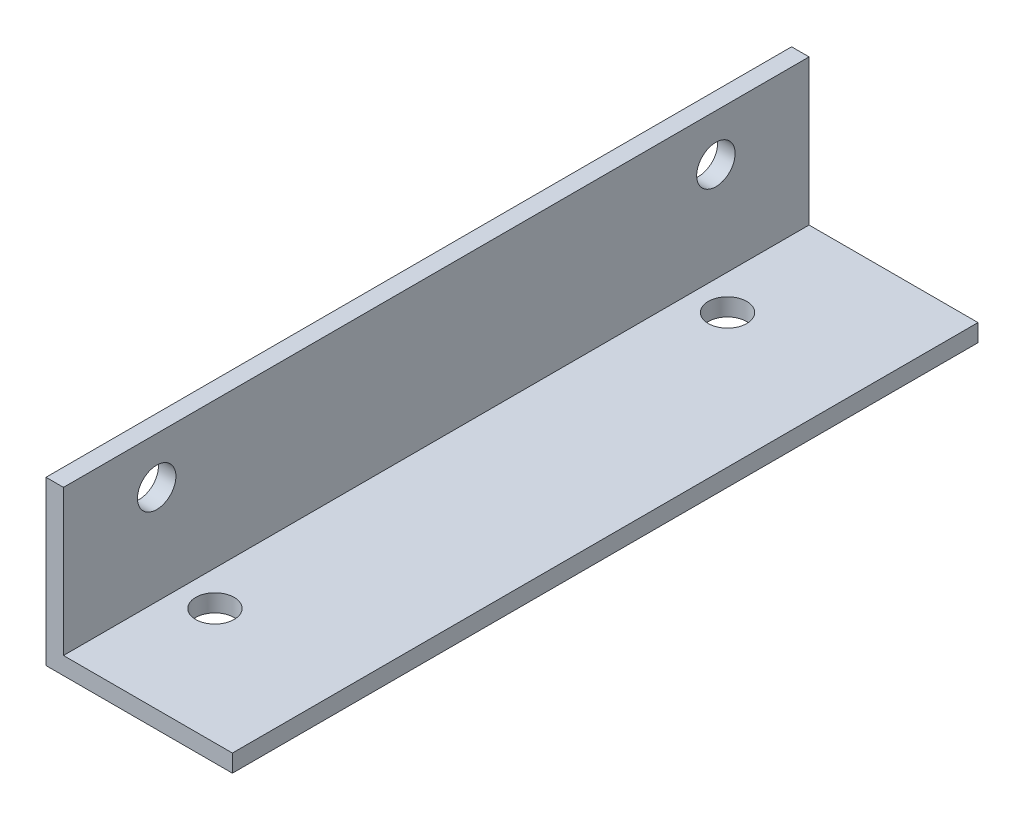
ISO-10303-21;
HEADER;
FILE_DESCRIPTION(('STEP AP214'),'2;1');
FILE_NAME('part.step','',(''),(''),'','','');
FILE_SCHEMA(('AUTOMOTIVE_DESIGN { 1 0 10303 214 1 1 1 1 }'));
ENDSEC;
DATA;
#1=APPLICATION_CONTEXT('core data for automotive mechanical design processes');
#2=APPLICATION_PROTOCOL_DEFINITION('international standard','automotive_design',2000,#1);
#3=PRODUCT_CONTEXT('',#1,'mechanical');
#4=PRODUCT('Part','Part','',(#3));
#5=PRODUCT_RELATED_PRODUCT_CATEGORY('part','',(#4));
#6=PRODUCT_DEFINITION_FORMATION('','',#4);
#7=PRODUCT_DEFINITION_CONTEXT('part definition',#1,'design');
#8=PRODUCT_DEFINITION('design','',#6,#7);
#9=PRODUCT_DEFINITION_SHAPE('','',#8);
#10=(LENGTH_UNIT() NAMED_UNIT(*) SI_UNIT(.MILLI.,.METRE.));
#11=(NAMED_UNIT(*) PLANE_ANGLE_UNIT() SI_UNIT($,.RADIAN.));
#12=(NAMED_UNIT(*) SI_UNIT($,.STERADIAN.) SOLID_ANGLE_UNIT());
#13=UNCERTAINTY_MEASURE_WITH_UNIT(LENGTH_MEASURE(1.E-05),#10,'distance_accuracy_value','');
#14=(GEOMETRIC_REPRESENTATION_CONTEXT(3) GLOBAL_UNCERTAINTY_ASSIGNED_CONTEXT((#13)) GLOBAL_UNIT_ASSIGNED_CONTEXT((#10,
#11,#12)) REPRESENTATION_CONTEXT('',''));
#15=CARTESIAN_POINT('',(0.,0.,0.));
#16=DIRECTION('',(0.,0.,1.));
#17=DIRECTION('',(1.,0.,0.));
#18=AXIS2_PLACEMENT_3D('',#15,#16,#17);
#19=CARTESIAN_POINT('',(0.,14.,32.));
#20=DIRECTION('',(1.,0.,0.));
#21=DIRECTION('',(0.,0.,-1.));
#22=AXIS2_PLACEMENT_3D('',#19,#20,#21);
#23=PLANE('',#22);
#24=CARTESIAN_POINT('',(0.,10.,24.));
#25=DIRECTION('',(1.,0.,0.));
#26=DIRECTION('',(0.,0.,-1.));
#27=AXIS2_PLACEMENT_3D('',#24,#25,#26);
#28=CIRCLE('',#27,1.65);
#29=CARTESIAN_POINT('',(0.,10.,22.35));
#30=VERTEX_POINT('',#29);
#31=EDGE_CURVE('E170',#30,#30,#28,.T.);
#32=ORIENTED_EDGE('',*,*,#31,.T.);
#33=EDGE_LOOP('',(#32));
#34=FACE_BOUND('',#33,.T.);
#35=CARTESIAN_POINT('',(0.,10.,-24.));
#36=DIRECTION('',(1.,0.,0.));
#37=DIRECTION('',(0.,0.,-1.));
#38=AXIS2_PLACEMENT_3D('',#35,#36,#37);
#39=CIRCLE('',#38,1.65);
#40=CARTESIAN_POINT('',(0.,10.,-25.65));
#41=VERTEX_POINT('',#40);
#42=EDGE_CURVE('E141',#41,#41,#39,.T.);
#43=ORIENTED_EDGE('',*,*,#42,.T.);
#44=EDGE_LOOP('',(#43));
#45=FACE_BOUND('',#44,.T.);
#46=DIRECTION('',(0.,-1.,0.));
#47=VECTOR('',#46,1.);
#48=CARTESIAN_POINT('',(0.,14.,-32.));
#49=LINE('',#48,#47);
#50=CARTESIAN_POINT('',(0.,14.,-32.));
#51=VERTEX_POINT('',#50);
#52=CARTESIAN_POINT('',(0.,0.,-32.));
#53=VERTEX_POINT('',#52);
#54=EDGE_CURVE('E136',#51,#53,#49,.T.);
#55=ORIENTED_EDGE('',*,*,#54,.T.);
#56=DIRECTION('',(0.,0.,-1.));
#57=VECTOR('',#56,1.);
#58=CARTESIAN_POINT('',(0.,0.,32.));
#59=LINE('',#58,#57);
#60=CARTESIAN_POINT('',(0.,0.,32.));
#61=VERTEX_POINT('',#60);
#62=EDGE_CURVE('E11',#61,#53,#59,.T.);
#63=ORIENTED_EDGE('',*,*,#62,.F.);
#64=DIRECTION('',(0.,-1.,0.));
#65=VECTOR('',#64,1.);
#66=CARTESIAN_POINT('',(0.,14.,32.));
#67=LINE('',#66,#65);
#68=CARTESIAN_POINT('',(0.,14.,32.));
#69=VERTEX_POINT('',#68);
#70=EDGE_CURVE('E153',#69,#61,#67,.T.);
#71=ORIENTED_EDGE('',*,*,#70,.F.);
#72=DIRECTION('',(0.,0.,-1.));
#73=VECTOR('',#72,1.);
#74=CARTESIAN_POINT('',(0.,14.,32.));
#75=LINE('',#74,#73);
#76=EDGE_CURVE('E132',#69,#51,#75,.T.);
#77=ORIENTED_EDGE('',*,*,#76,.T.);
#78=EDGE_LOOP('',(#55,#63,#71,#77));
#79=FACE_BOUND('',#78,.T.);
#80=ADVANCED_FACE('F44',(#34,#45,#79),#23,.F.);
#81=CARTESIAN_POINT('',(0.,0.,32.));
#82=DIRECTION('',(0.,1.,0.));
#83=DIRECTION('',(0.,0.,1.));
#84=AXIS2_PLACEMENT_3D('',#81,#82,#83);
#85=PLANE('',#84);
#86=CARTESIAN_POINT('',(4.5,0.,22.));
#87=DIRECTION('',(0.,1.,0.));
#88=DIRECTION('',(0.,0.,1.));
#89=AXIS2_PLACEMENT_3D('',#86,#87,#88);
#90=CIRCLE('',#89,1.65);
#91=CARTESIAN_POINT('',(4.5,0.,23.65));
#92=VERTEX_POINT('',#91);
#93=EDGE_CURVE('E174',#92,#92,#90,.T.);
#94=ORIENTED_EDGE('',*,*,#93,.T.);
#95=EDGE_LOOP('',(#94));
#96=FACE_BOUND('',#95,.T.);
#97=CARTESIAN_POINT('',(4.5,0.,-22.));
#98=DIRECTION('',(0.,1.,0.));
#99=DIRECTION('',(0.,0.,1.));
#100=AXIS2_PLACEMENT_3D('',#97,#98,#99);
#101=CIRCLE('',#100,1.65);
#102=CARTESIAN_POINT('',(4.5,0.,-20.35));
#103=VERTEX_POINT('',#102);
#104=EDGE_CURVE('E166',#103,#103,#101,.T.);
#105=ORIENTED_EDGE('',*,*,#104,.T.);
#106=EDGE_LOOP('',(#105));
#107=FACE_BOUND('',#106,.T.);
#108=DIRECTION('',(1.,0.,0.));
#109=VECTOR('',#108,1.);
#110=CARTESIAN_POINT('',(0.,0.,-32.));
#111=LINE('',#110,#109);
#112=CARTESIAN_POINT('',(16.,0.,-32.));
#113=VERTEX_POINT('',#112);
#114=EDGE_CURVE('E140',#53,#113,#111,.T.);
#115=ORIENTED_EDGE('',*,*,#114,.T.);
#116=DIRECTION('',(0.,0.,-1.));
#117=VECTOR('',#116,1.);
#118=CARTESIAN_POINT('',(16.,0.,32.));
#119=LINE('',#118,#117);
#120=CARTESIAN_POINT('',(16.,0.,32.));
#121=VERTEX_POINT('',#120);
#122=EDGE_CURVE('E54',#121,#113,#119,.T.);
#123=ORIENTED_EDGE('',*,*,#122,.F.);
#124=DIRECTION('',(1.,0.,0.));
#125=VECTOR('',#124,1.);
#126=CARTESIAN_POINT('',(0.,0.,32.));
#127=LINE('',#126,#125);
#128=EDGE_CURVE('E100',#61,#121,#127,.T.);
#129=ORIENTED_EDGE('',*,*,#128,.F.);
#130=ORIENTED_EDGE('',*,*,#62,.T.);
#131=EDGE_LOOP('',(#115,#123,#129,#130));
#132=FACE_BOUND('',#131,.T.);
#133=ADVANCED_FACE('F200',(#96,#107,#132),#85,.F.);
#134=CARTESIAN_POINT('',(16.,0.,32.));
#135=DIRECTION('',(-1.,0.,0.));
#136=DIRECTION('',(0.,0.,1.));
#137=AXIS2_PLACEMENT_3D('',#134,#135,#136);
#138=PLANE('',#137);
#139=DIRECTION('',(0.,1.,0.));
#140=VECTOR('',#139,1.);
#141=CARTESIAN_POINT('',(16.,0.,-32.));
#142=LINE('',#141,#140);
#143=CARTESIAN_POINT('',(16.,1.5,-32.));
#144=VERTEX_POINT('',#143);
#145=EDGE_CURVE('E144',#113,#144,#142,.T.);
#146=ORIENTED_EDGE('',*,*,#145,.T.);
#147=DIRECTION('',(0.,0.,-1.));
#148=VECTOR('',#147,1.);
#149=CARTESIAN_POINT('',(16.,1.5,32.));
#150=LINE('',#149,#148);
#151=CARTESIAN_POINT('',(16.,1.5,32.));
#152=VERTEX_POINT('',#151);
#153=EDGE_CURVE('E124',#152,#144,#150,.T.);
#154=ORIENTED_EDGE('',*,*,#153,.F.);
#155=DIRECTION('',(0.,1.,0.));
#156=VECTOR('',#155,1.);
#157=CARTESIAN_POINT('',(16.,0.,32.));
#158=LINE('',#157,#156);
#159=EDGE_CURVE('E113',#121,#152,#158,.T.);
#160=ORIENTED_EDGE('',*,*,#159,.F.);
#161=ORIENTED_EDGE('',*,*,#122,.T.);
#162=EDGE_LOOP('',(#146,#154,#160,#161));
#163=FACE_BOUND('',#162,.T.);
#164=ADVANCED_FACE('F203',(#163),#138,.F.);
#165=CARTESIAN_POINT('',(16.,1.5,32.));
#166=DIRECTION('',(0.,-1.,0.));
#167=DIRECTION('',(0.,0.,-1.));
#168=AXIS2_PLACEMENT_3D('',#165,#166,#167);
#169=PLANE('',#168);
#170=CARTESIAN_POINT('',(4.5,1.5,22.));
#171=DIRECTION('',(0.,-1.,0.));
#172=DIRECTION('',(0.,0.,-1.));
#173=AXIS2_PLACEMENT_3D('',#170,#171,#172);
#174=CIRCLE('',#173,1.65);
#175=CARTESIAN_POINT('',(4.5,1.5,20.35));
#176=VERTEX_POINT('',#175);
#177=EDGE_CURVE('E47',#176,#176,#174,.T.);
#178=ORIENTED_EDGE('',*,*,#177,.T.);
#179=EDGE_LOOP('',(#178));
#180=FACE_BOUND('',#179,.T.);
#181=CARTESIAN_POINT('',(4.5,1.5,-22.));
#182=DIRECTION('',(0.,-1.,0.));
#183=DIRECTION('',(0.,0.,-1.));
#184=AXIS2_PLACEMENT_3D('',#181,#182,#183);
#185=CIRCLE('',#184,1.65);
#186=CARTESIAN_POINT('',(4.5,1.5,-23.65));
#187=VERTEX_POINT('',#186);
#188=EDGE_CURVE('E167',#187,#187,#185,.T.);
#189=ORIENTED_EDGE('',*,*,#188,.T.);
#190=EDGE_LOOP('',(#189));
#191=FACE_BOUND('',#190,.T.);
#192=DIRECTION('',(-1.,0.,0.));
#193=VECTOR('',#192,1.);
#194=CARTESIAN_POINT('',(16.,1.5,-32.));
#195=LINE('',#194,#193);
#196=CARTESIAN_POINT('',(1.5,1.5,-32.));
#197=VERTEX_POINT('',#196);
#198=EDGE_CURVE('E122',#144,#197,#195,.T.);
#199=ORIENTED_EDGE('',*,*,#198,.T.);
#200=DIRECTION('',(0.,0.,-1.));
#201=VECTOR('',#200,1.);
#202=CARTESIAN_POINT('',(1.5,1.5,32.));
#203=LINE('',#202,#201);
#204=CARTESIAN_POINT('',(1.5,1.5,32.));
#205=VERTEX_POINT('',#204);
#206=EDGE_CURVE('E119',#205,#197,#203,.T.);
#207=ORIENTED_EDGE('',*,*,#206,.F.);
#208=DIRECTION('',(-1.,0.,0.));
#209=VECTOR('',#208,1.);
#210=CARTESIAN_POINT('',(16.,1.5,32.));
#211=LINE('',#210,#209);
#212=EDGE_CURVE('E107',#152,#205,#211,.T.);
#213=ORIENTED_EDGE('',*,*,#212,.F.);
#214=ORIENTED_EDGE('',*,*,#153,.T.);
#215=EDGE_LOOP('',(#199,#207,#213,#214));
#216=FACE_BOUND('',#215,.T.);
#217=ADVANCED_FACE('F120',(#180,#191,#216),#169,.F.);
#218=CARTESIAN_POINT('',(1.5,1.5,32.));
#219=DIRECTION('',(-1.,0.,0.));
#220=DIRECTION('',(0.,0.,1.));
#221=AXIS2_PLACEMENT_3D('',#218,#219,#220);
#222=PLANE('',#221);
#223=CARTESIAN_POINT('',(1.5,10.,24.));
#224=DIRECTION('',(-1.,0.,0.));
#225=DIRECTION('',(0.,0.,1.));
#226=AXIS2_PLACEMENT_3D('',#223,#224,#225);
#227=CIRCLE('',#226,1.65);
#228=CARTESIAN_POINT('',(1.5,10.,25.65));
#229=VERTEX_POINT('',#228);
#230=EDGE_CURVE('E171',#229,#229,#227,.T.);
#231=ORIENTED_EDGE('',*,*,#230,.T.);
#232=EDGE_LOOP('',(#231));
#233=FACE_BOUND('',#232,.T.);
#234=CARTESIAN_POINT('',(1.5,10.,-24.));
#235=DIRECTION('',(-1.,0.,0.));
#236=DIRECTION('',(0.,0.,1.));
#237=AXIS2_PLACEMENT_3D('',#234,#235,#236);
#238=CIRCLE('',#237,1.65);
#239=CARTESIAN_POINT('',(1.5,10.,-22.35));
#240=VERTEX_POINT('',#239);
#241=EDGE_CURVE('E162',#240,#240,#238,.T.);
#242=ORIENTED_EDGE('',*,*,#241,.T.);
#243=EDGE_LOOP('',(#242));
#244=FACE_BOUND('',#243,.T.);
#245=DIRECTION('',(0.,1.,0.));
#246=VECTOR('',#245,1.);
#247=CARTESIAN_POINT('',(1.5,1.5,-32.));
#248=LINE('',#247,#246);
#249=CARTESIAN_POINT('',(1.5,14.,-32.));
#250=VERTEX_POINT('',#249);
#251=EDGE_CURVE('E86',#197,#250,#248,.T.);
#252=ORIENTED_EDGE('',*,*,#251,.T.);
#253=DIRECTION('',(0.,0.,-1.));
#254=VECTOR('',#253,1.);
#255=CARTESIAN_POINT('',(1.5,14.,32.));
#256=LINE('',#255,#254);
#257=CARTESIAN_POINT('',(1.5,14.,32.));
#258=VERTEX_POINT('',#257);
#259=EDGE_CURVE('E125',#258,#250,#256,.T.);
#260=ORIENTED_EDGE('',*,*,#259,.F.);
#261=DIRECTION('',(0.,1.,0.));
#262=VECTOR('',#261,1.);
#263=CARTESIAN_POINT('',(1.5,1.5,32.));
#264=LINE('',#263,#262);
#265=EDGE_CURVE('E111',#205,#258,#264,.T.);
#266=ORIENTED_EDGE('',*,*,#265,.F.);
#267=ORIENTED_EDGE('',*,*,#206,.T.);
#268=EDGE_LOOP('',(#252,#260,#266,#267));
#269=FACE_BOUND('',#268,.T.);
#270=ADVANCED_FACE('F127',(#233,#244,#269),#222,.F.);
#271=CARTESIAN_POINT('',(1.5,14.,32.));
#272=DIRECTION('',(0.,-1.,0.));
#273=DIRECTION('',(0.,0.,-1.));
#274=AXIS2_PLACEMENT_3D('',#271,#272,#273);
#275=PLANE('',#274);
#276=DIRECTION('',(-1.,0.,0.));
#277=VECTOR('',#276,1.);
#278=CARTESIAN_POINT('',(1.5,14.,-32.));
#279=LINE('',#278,#277);
#280=EDGE_CURVE('E92',#250,#51,#279,.T.);
#281=ORIENTED_EDGE('',*,*,#280,.T.);
#282=ORIENTED_EDGE('',*,*,#76,.F.);
#283=DIRECTION('',(-1.,0.,0.));
#284=VECTOR('',#283,1.);
#285=CARTESIAN_POINT('',(1.5,14.,32.));
#286=LINE('',#285,#284);
#287=EDGE_CURVE('E63',#258,#69,#286,.T.);
#288=ORIENTED_EDGE('',*,*,#287,.F.);
#289=ORIENTED_EDGE('',*,*,#259,.T.);
#290=EDGE_LOOP('',(#281,#282,#288,#289));
#291=FACE_BOUND('',#290,.T.);
#292=ADVANCED_FACE('F208',(#291),#275,.F.);
#293=CARTESIAN_POINT('',(0.,0.,32.));
#294=DIRECTION('',(0.,0.,1.));
#295=DIRECTION('',(1.,0.,0.));
#296=AXIS2_PLACEMENT_3D('',#293,#294,#295);
#297=PLANE('',#296);
#298=ORIENTED_EDGE('',*,*,#70,.T.);
#299=ORIENTED_EDGE('',*,*,#128,.T.);
#300=ORIENTED_EDGE('',*,*,#159,.T.);
#301=ORIENTED_EDGE('',*,*,#212,.T.);
#302=ORIENTED_EDGE('',*,*,#265,.T.);
#303=ORIENTED_EDGE('',*,*,#287,.T.);
#304=EDGE_LOOP('',(#298,#299,#300,#301,#302,#303));
#305=FACE_BOUND('',#304,.T.);
#306=ADVANCED_FACE('F109',(#305),#297,.T.);
#307=CARTESIAN_POINT('',(0.,0.,-32.));
#308=DIRECTION('',(0.,0.,1.));
#309=DIRECTION('',(1.,0.,0.));
#310=AXIS2_PLACEMENT_3D('',#307,#308,#309);
#311=PLANE('',#310);
#312=ORIENTED_EDGE('',*,*,#54,.F.);
#313=ORIENTED_EDGE('',*,*,#280,.F.);
#314=ORIENTED_EDGE('',*,*,#251,.F.);
#315=ORIENTED_EDGE('',*,*,#198,.F.);
#316=ORIENTED_EDGE('',*,*,#145,.F.);
#317=ORIENTED_EDGE('',*,*,#114,.F.);
#318=EDGE_LOOP('',(#312,#313,#314,#315,#316,#317));
#319=FACE_BOUND('',#318,.T.);
#320=ADVANCED_FACE('F206',(#319),#311,.F.);
#321=CARTESIAN_POINT('',(-100.,10.,-24.));
#322=DIRECTION('',(1.,0.,0.));
#323=DIRECTION('',(0.,0.,-1.));
#324=AXIS2_PLACEMENT_3D('',#321,#322,#323);
#325=CYLINDRICAL_SURFACE('',#324,1.65);
#326=ORIENTED_EDGE('',*,*,#241,.F.);
#327=EDGE_LOOP('',(#326));
#328=FACE_BOUND('',#327,.T.);
#329=ORIENTED_EDGE('',*,*,#42,.F.);
#330=EDGE_LOOP('',(#329));
#331=FACE_BOUND('',#330,.T.);
#332=ADVANCED_FACE('F227',(#328,#331),#325,.F.);
#333=CARTESIAN_POINT('',(4.5,-100.,-22.));
#334=DIRECTION('',(0.,1.,0.));
#335=DIRECTION('',(0.,0.,1.));
#336=AXIS2_PLACEMENT_3D('',#333,#334,#335);
#337=CYLINDRICAL_SURFACE('',#336,1.65);
#338=ORIENTED_EDGE('',*,*,#188,.F.);
#339=EDGE_LOOP('',(#338));
#340=FACE_BOUND('',#339,.T.);
#341=ORIENTED_EDGE('',*,*,#104,.F.);
#342=EDGE_LOOP('',(#341));
#343=FACE_BOUND('',#342,.T.);
#344=ADVANCED_FACE('F229',(#340,#343),#337,.F.);
#345=CARTESIAN_POINT('',(-100.,10.,24.));
#346=DIRECTION('',(1.,0.,0.));
#347=DIRECTION('',(0.,0.,-1.));
#348=AXIS2_PLACEMENT_3D('',#345,#346,#347);
#349=CYLINDRICAL_SURFACE('',#348,1.65);
#350=ORIENTED_EDGE('',*,*,#230,.F.);
#351=EDGE_LOOP('',(#350));
#352=FACE_BOUND('',#351,.T.);
#353=ORIENTED_EDGE('',*,*,#31,.F.);
#354=EDGE_LOOP('',(#353));
#355=FACE_BOUND('',#354,.T.);
#356=ADVANCED_FACE('F236',(#352,#355),#349,.F.);
#357=CARTESIAN_POINT('',(4.5,-100.,22.));
#358=DIRECTION('',(0.,1.,0.));
#359=DIRECTION('',(0.,0.,1.));
#360=AXIS2_PLACEMENT_3D('',#357,#358,#359);
#361=CYLINDRICAL_SURFACE('',#360,1.65);
#362=ORIENTED_EDGE('',*,*,#177,.F.);
#363=EDGE_LOOP('',(#362));
#364=FACE_BOUND('',#363,.T.);
#365=ORIENTED_EDGE('',*,*,#93,.F.);
#366=EDGE_LOOP('',(#365));
#367=FACE_BOUND('',#366,.T.);
#368=ADVANCED_FACE('F243',(#364,#367),#361,.F.);
#369=CLOSED_SHELL('',(#80,#133,#164,#217,#270,#292,#306,#320,#332,#344,#356,#368));
#370=MANIFOLD_SOLID_BREP('B2',#369);
#371=ADVANCED_BREP_SHAPE_REPRESENTATION('',(#18,#370),#14);
#372=SHAPE_DEFINITION_REPRESENTATION(#9,#371);
ENDSEC;
END-ISO-10303-21;
